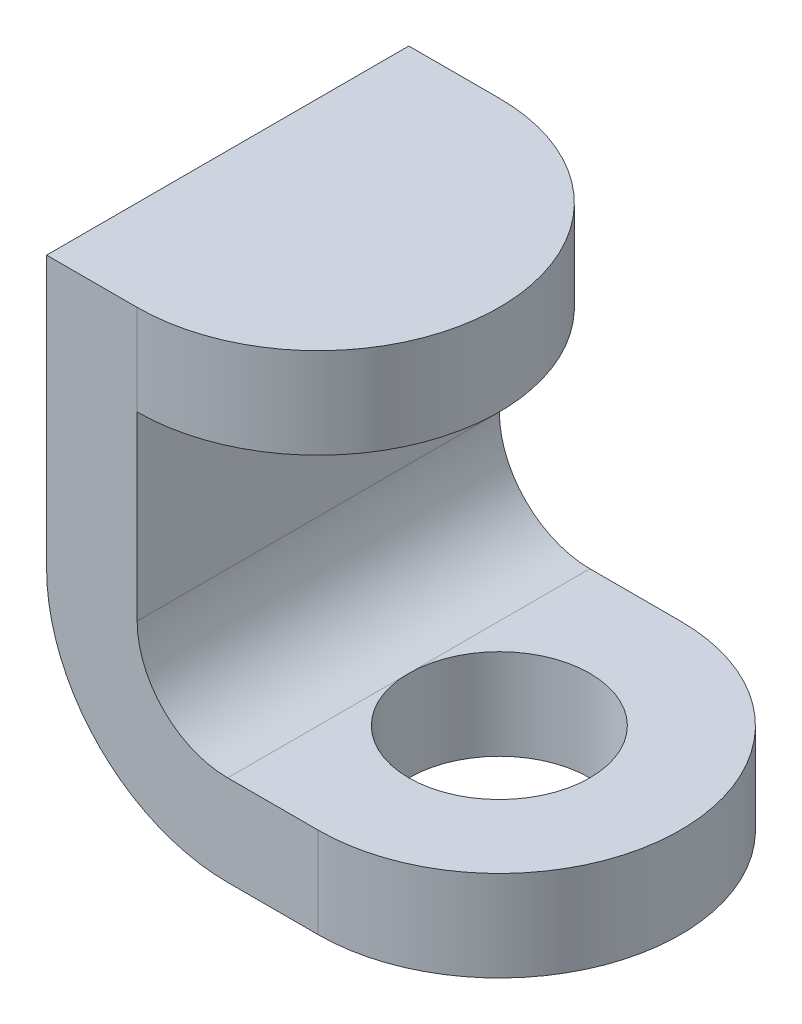
ISO-10303-21;
HEADER;
FILE_DESCRIPTION(('STEP AP214'),'2;1');
FILE_NAME('part.step','',(''),(''),'','','');
FILE_SCHEMA(('AUTOMOTIVE_DESIGN { 1 0 10303 214 1 1 1 1 }'));
ENDSEC;
DATA;
#1=APPLICATION_CONTEXT('core data for automotive mechanical design processes');
#2=APPLICATION_PROTOCOL_DEFINITION('international standard','automotive_design',2000,#1);
#3=PRODUCT_CONTEXT('',#1,'mechanical');
#4=PRODUCT('Part','Part','',(#3));
#5=PRODUCT_RELATED_PRODUCT_CATEGORY('part','',(#4));
#6=PRODUCT_DEFINITION_FORMATION('','',#4);
#7=PRODUCT_DEFINITION_CONTEXT('part definition',#1,'design');
#8=PRODUCT_DEFINITION('design','',#6,#7);
#9=PRODUCT_DEFINITION_SHAPE('','',#8);
#10=(LENGTH_UNIT() NAMED_UNIT(*) SI_UNIT(.MILLI.,.METRE.));
#11=(NAMED_UNIT(*) PLANE_ANGLE_UNIT() SI_UNIT($,.RADIAN.));
#12=(NAMED_UNIT(*) SI_UNIT($,.STERADIAN.) SOLID_ANGLE_UNIT());
#13=UNCERTAINTY_MEASURE_WITH_UNIT(LENGTH_MEASURE(1.E-05),#10,'distance_accuracy_value','');
#14=(GEOMETRIC_REPRESENTATION_CONTEXT(3) GLOBAL_UNCERTAINTY_ASSIGNED_CONTEXT((#13)) GLOBAL_UNIT_ASSIGNED_CONTEXT((#10,
#11,#12)) REPRESENTATION_CONTEXT('',''));
#15=CARTESIAN_POINT('',(0.,0.,0.));
#16=DIRECTION('',(0.,0.,1.));
#17=DIRECTION('',(1.,0.,0.));
#18=AXIS2_PLACEMENT_3D('',#15,#16,#17);
#19=CARTESIAN_POINT('',(30.,0.,0.));
#20=DIRECTION('',(0.,-1.,0.));
#21=DIRECTION('',(0.,0.,-1.));
#22=AXIS2_PLACEMENT_3D('',#19,#20,#21);
#23=CYLINDRICAL_SURFACE('',#22,20.);
#24=DIRECTION('',(0.,1.,0.));
#25=VECTOR('',#24,1.);
#26=CARTESIAN_POINT('',(30.,0.,20.));
#27=LINE('',#26,#25);
#28=CARTESIAN_POINT('',(30.,0.,20.));
#29=VERTEX_POINT('',#28);
#30=CARTESIAN_POINT('',(30.,10.,20.));
#31=VERTEX_POINT('',#30);
#32=EDGE_CURVE('E189',#29,#31,#27,.T.);
#33=ORIENTED_EDGE('',*,*,#32,.F.);
#34=CARTESIAN_POINT('',(30.,0.,0.));
#35=DIRECTION('',(0.,1.,0.));
#36=DIRECTION('',(0.,0.,1.));
#37=AXIS2_PLACEMENT_3D('',#34,#35,#36);
#38=CIRCLE('',#37,20.);
#39=CARTESIAN_POINT('',(30.,0.,-20.));
#40=VERTEX_POINT('',#39);
#41=EDGE_CURVE('E43',#40,#29,#38,.F.);
#42=ORIENTED_EDGE('',*,*,#41,.F.);
#43=DIRECTION('',(0.,-1.,0.));
#44=VECTOR('',#43,1.);
#45=CARTESIAN_POINT('',(30.,0.,-20.));
#46=LINE('',#45,#44);
#47=CARTESIAN_POINT('',(30.,10.,-20.));
#48=VERTEX_POINT('',#47);
#49=EDGE_CURVE('E192',#48,#40,#46,.T.);
#50=ORIENTED_EDGE('',*,*,#49,.F.);
#51=CARTESIAN_POINT('',(30.,10.,0.));
#52=DIRECTION('',(0.,1.,0.));
#53=DIRECTION('',(0.,0.,1.));
#54=AXIS2_PLACEMENT_3D('',#51,#52,#53);
#55=CIRCLE('',#54,20.);
#56=EDGE_CURVE('E11',#31,#48,#55,.T.);
#57=ORIENTED_EDGE('',*,*,#56,.F.);
#58=EDGE_LOOP('',(#33,#42,#50,#57));
#59=FACE_BOUND('',#58,.T.);
#60=ADVANCED_FACE('F35',(#59),#23,.T.);
#61=CARTESIAN_POINT('',(10.,40.,0.));
#62=DIRECTION('',(0.,-1.,0.));
#63=DIRECTION('',(0.,0.,-1.));
#64=AXIS2_PLACEMENT_3D('',#61,#62,#63);
#65=CYLINDRICAL_SURFACE('',#64,20.);
#66=DIRECTION('',(0.,1.,0.));
#67=VECTOR('',#66,1.);
#68=CARTESIAN_POINT('',(10.,40.,20.));
#69=LINE('',#68,#67);
#70=CARTESIAN_POINT('',(10.,40.,20.));
#71=VERTEX_POINT('',#70);
#72=CARTESIAN_POINT('',(10.,50.,20.));
#73=VERTEX_POINT('',#72);
#74=EDGE_CURVE('E121',#71,#73,#69,.T.);
#75=ORIENTED_EDGE('',*,*,#74,.F.);
#76=CARTESIAN_POINT('',(10.,40.,0.));
#77=DIRECTION('',(0.,-1.,0.));
#78=DIRECTION('',(0.,0.,-1.));
#79=AXIS2_PLACEMENT_3D('',#76,#77,#78);
#80=CIRCLE('',#79,20.);
#81=CARTESIAN_POINT('',(10.,40.,-20.));
#82=VERTEX_POINT('',#81);
#83=EDGE_CURVE('E108',#82,#71,#80,.T.);
#84=ORIENTED_EDGE('',*,*,#83,.F.);
#85=DIRECTION('',(0.,-1.,0.));
#86=VECTOR('',#85,1.);
#87=CARTESIAN_POINT('',(10.,0.,-20.));
#88=LINE('',#87,#86);
#89=CARTESIAN_POINT('',(10.,50.,-20.));
#90=VERTEX_POINT('',#89);
#91=EDGE_CURVE('E118',#90,#82,#88,.T.);
#92=ORIENTED_EDGE('',*,*,#91,.F.);
#93=CARTESIAN_POINT('',(10.,50.,0.));
#94=DIRECTION('',(0.,-1.,0.));
#95=DIRECTION('',(0.,0.,-1.));
#96=AXIS2_PLACEMENT_3D('',#93,#94,#95);
#97=CIRCLE('',#96,20.);
#98=EDGE_CURVE('E117',#73,#90,#97,.F.);
#99=ORIENTED_EDGE('',*,*,#98,.F.);
#100=EDGE_LOOP('',(#75,#84,#92,#99));
#101=FACE_BOUND('',#100,.T.);
#102=ADVANCED_FACE('F122',(#101),#65,.T.);
#103=CARTESIAN_POINT('',(0.,0.,20.));
#104=DIRECTION('',(0.,1.,0.));
#105=DIRECTION('',(0.,0.,1.));
#106=AXIS2_PLACEMENT_3D('',#103,#104,#105);
#107=PLANE('',#106);
#108=DIRECTION('',(0.,0.,-1.));
#109=VECTOR('',#108,1.);
#110=CARTESIAN_POINT('',(20.,0.,20.));
#111=LINE('',#110,#109);
#112=CARTESIAN_POINT('',(20.,0.,20.));
#113=VERTEX_POINT('',#112);
#114=CARTESIAN_POINT('',(20.,0.,0.));
#115=VERTEX_POINT('',#114);
#116=EDGE_CURVE('E169',#113,#115,#111,.T.);
#117=ORIENTED_EDGE('',*,*,#116,.T.);
#118=CARTESIAN_POINT('',(30.,0.,0.));
#119=DIRECTION('',(0.,1.,0.));
#120=DIRECTION('',(0.,0.,1.));
#121=AXIS2_PLACEMENT_3D('',#118,#119,#120);
#122=CIRCLE('',#121,10.);
#123=EDGE_CURVE('E48',#115,#115,#122,.T.);
#124=ORIENTED_EDGE('',*,*,#123,.T.);
#125=CARTESIAN_POINT('',(20.,0.,-20.));
#126=VERTEX_POINT('',#125);
#127=EDGE_CURVE('E136',#115,#126,#111,.T.);
#128=ORIENTED_EDGE('',*,*,#127,.T.);
#129=DIRECTION('',(1.,0.,0.));
#130=VECTOR('',#129,1.);
#131=CARTESIAN_POINT('',(0.,0.,-20.));
#132=LINE('',#131,#130);
#133=EDGE_CURVE('E155',#126,#40,#132,.T.);
#134=ORIENTED_EDGE('',*,*,#133,.T.);
#135=ORIENTED_EDGE('',*,*,#41,.T.);
#136=DIRECTION('',(1.,0.,0.));
#137=VECTOR('',#136,1.);
#138=CARTESIAN_POINT('',(0.,0.,20.));
#139=LINE('',#138,#137);
#140=EDGE_CURVE('E149',#113,#29,#139,.T.);
#141=ORIENTED_EDGE('',*,*,#140,.F.);
#142=EDGE_LOOP('',(#117,#124,#128,#134,#135,#141));
#143=FACE_BOUND('',#142,.T.);
#144=ADVANCED_FACE('F197',(#143),#107,.F.);
#145=CARTESIAN_POINT('',(0.,10.,20.));
#146=DIRECTION('',(0.,1.,0.));
#147=DIRECTION('',(0.,0.,1.));
#148=AXIS2_PLACEMENT_3D('',#145,#146,#147);
#149=PLANE('',#148);
#150=DIRECTION('',(0.,0.,-1.));
#151=VECTOR('',#150,1.);
#152=CARTESIAN_POINT('',(20.,10.,20.));
#153=LINE('',#152,#151);
#154=CARTESIAN_POINT('',(20.,10.,-20.));
#155=VERTEX_POINT('',#154);
#156=CARTESIAN_POINT('',(20.,10.,0.));
#157=VERTEX_POINT('',#156);
#158=EDGE_CURVE('E181',#155,#157,#153,.F.);
#159=ORIENTED_EDGE('',*,*,#158,.T.);
#160=CARTESIAN_POINT('',(30.,10.,0.));
#161=DIRECTION('',(0.,1.,0.));
#162=DIRECTION('',(0.,0.,1.));
#163=AXIS2_PLACEMENT_3D('',#160,#161,#162);
#164=CIRCLE('',#163,10.);
#165=EDGE_CURVE('E53',#157,#157,#164,.T.);
#166=ORIENTED_EDGE('',*,*,#165,.F.);
#167=CARTESIAN_POINT('',(20.,10.,20.));
#168=VERTEX_POINT('',#167);
#169=EDGE_CURVE('E180',#157,#168,#153,.F.);
#170=ORIENTED_EDGE('',*,*,#169,.T.);
#171=DIRECTION('',(1.,0.,0.));
#172=VECTOR('',#171,1.);
#173=CARTESIAN_POINT('',(0.,10.,20.));
#174=LINE('',#173,#172);
#175=EDGE_CURVE('E144',#168,#31,#174,.T.);
#176=ORIENTED_EDGE('',*,*,#175,.T.);
#177=ORIENTED_EDGE('',*,*,#56,.T.);
#178=DIRECTION('',(1.,0.,0.));
#179=VECTOR('',#178,1.);
#180=CARTESIAN_POINT('',(0.,10.,-20.));
#181=LINE('',#180,#179);
#182=EDGE_CURVE('E158',#155,#48,#181,.T.);
#183=ORIENTED_EDGE('',*,*,#182,.F.);
#184=EDGE_LOOP('',(#159,#166,#170,#176,#177,#183));
#185=FACE_BOUND('',#184,.T.);
#186=ADVANCED_FACE('F216',(#185),#149,.T.);
#187=CARTESIAN_POINT('',(10.,0.,20.));
#188=DIRECTION('',(1.,0.,0.));
#189=DIRECTION('',(0.,0.,-1.));
#190=AXIS2_PLACEMENT_3D('',#187,#188,#189);
#191=PLANE('',#190);
#192=DIRECTION('',(0.,1.,0.));
#193=VECTOR('',#192,1.);
#194=CARTESIAN_POINT('',(10.,0.,20.));
#195=LINE('',#194,#193);
#196=CARTESIAN_POINT('',(10.,20.,20.));
#197=VERTEX_POINT('',#196);
#198=EDGE_CURVE('E132',#71,#197,#195,.F.);
#199=ORIENTED_EDGE('',*,*,#198,.T.);
#200=DIRECTION('',(0.,0.,-1.));
#201=VECTOR('',#200,1.);
#202=CARTESIAN_POINT('',(10.,20.,-20.));
#203=LINE('',#202,#201);
#204=CARTESIAN_POINT('',(10.,20.,-20.));
#205=VERTEX_POINT('',#204);
#206=EDGE_CURVE('E178',#197,#205,#203,.T.);
#207=ORIENTED_EDGE('',*,*,#206,.T.);
#208=DIRECTION('',(0.,1.,0.));
#209=VECTOR('',#208,1.);
#210=CARTESIAN_POINT('',(10.,0.,-20.));
#211=LINE('',#210,#209);
#212=EDGE_CURVE('E135',#82,#205,#211,.F.);
#213=ORIENTED_EDGE('',*,*,#212,.F.);
#214=DIRECTION('',(0.,0.,-1.));
#215=VECTOR('',#214,1.);
#216=CARTESIAN_POINT('',(10.,40.,20.));
#217=LINE('',#216,#215);
#218=EDGE_CURVE('E112',#71,#82,#217,.T.);
#219=ORIENTED_EDGE('',*,*,#218,.F.);
#220=EDGE_LOOP('',(#199,#207,#213,#219));
#221=FACE_BOUND('',#220,.T.);
#222=ADVANCED_FACE('F130',(#221),#191,.T.);
#223=CARTESIAN_POINT('',(0.,40.,20.));
#224=DIRECTION('',(0.,-1.,0.));
#225=DIRECTION('',(0.,0.,-1.));
#226=AXIS2_PLACEMENT_3D('',#223,#224,#225);
#227=PLANE('',#226);
#228=ORIENTED_EDGE('',*,*,#218,.T.);
#229=ORIENTED_EDGE('',*,*,#83,.T.);
#230=EDGE_LOOP('',(#228,#229));
#231=FACE_BOUND('',#230,.T.);
#232=ADVANCED_FACE('F110',(#231),#227,.T.);
#233=CARTESIAN_POINT('',(0.,50.,20.));
#234=DIRECTION('',(0.,-1.,0.));
#235=DIRECTION('',(0.,0.,-1.));
#236=AXIS2_PLACEMENT_3D('',#233,#234,#235);
#237=PLANE('',#236);
#238=DIRECTION('',(-1.,0.,0.));
#239=VECTOR('',#238,1.);
#240=CARTESIAN_POINT('',(0.,50.,20.));
#241=LINE('',#240,#239);
#242=CARTESIAN_POINT('',(0.,50.,20.));
#243=VERTEX_POINT('',#242);
#244=EDGE_CURVE('E143',#73,#243,#241,.T.);
#245=ORIENTED_EDGE('',*,*,#244,.F.);
#246=ORIENTED_EDGE('',*,*,#98,.T.);
#247=DIRECTION('',(-1.,0.,0.));
#248=VECTOR('',#247,1.);
#249=CARTESIAN_POINT('',(0.,50.,-20.));
#250=LINE('',#249,#248);
#251=CARTESIAN_POINT('',(0.,50.,-20.));
#252=VERTEX_POINT('',#251);
#253=EDGE_CURVE('E162',#90,#252,#250,.T.);
#254=ORIENTED_EDGE('',*,*,#253,.T.);
#255=DIRECTION('',(0.,0.,-1.));
#256=VECTOR('',#255,1.);
#257=CARTESIAN_POINT('',(0.,50.,20.));
#258=LINE('',#257,#256);
#259=EDGE_CURVE('E137',#243,#252,#258,.T.);
#260=ORIENTED_EDGE('',*,*,#259,.F.);
#261=EDGE_LOOP('',(#245,#246,#254,#260));
#262=FACE_BOUND('',#261,.T.);
#263=ADVANCED_FACE('F223',(#262),#237,.F.);
#264=CARTESIAN_POINT('',(0.,0.,20.));
#265=DIRECTION('',(1.,0.,0.));
#266=DIRECTION('',(0.,0.,-1.));
#267=AXIS2_PLACEMENT_3D('',#264,#265,#266);
#268=PLANE('',#267);
#269=DIRECTION('',(0.,-1.,0.));
#270=VECTOR('',#269,1.);
#271=CARTESIAN_POINT('',(0.,0.,-20.));
#272=LINE('',#271,#270);
#273=CARTESIAN_POINT('',(0.,20.,-20.));
#274=VERTEX_POINT('',#273);
#275=EDGE_CURVE('E164',#252,#274,#272,.T.);
#276=ORIENTED_EDGE('',*,*,#275,.T.);
#277=DIRECTION('',(0.,0.,-1.));
#278=VECTOR('',#277,1.);
#279=CARTESIAN_POINT('',(0.,20.,20.));
#280=LINE('',#279,#278);
#281=CARTESIAN_POINT('',(0.,20.,20.));
#282=VERTEX_POINT('',#281);
#283=EDGE_CURVE('E174',#274,#282,#280,.F.);
#284=ORIENTED_EDGE('',*,*,#283,.T.);
#285=DIRECTION('',(0.,-1.,0.));
#286=VECTOR('',#285,1.);
#287=CARTESIAN_POINT('',(0.,0.,20.));
#288=LINE('',#287,#286);
#289=EDGE_CURVE('E146',#243,#282,#288,.T.);
#290=ORIENTED_EDGE('',*,*,#289,.F.);
#291=ORIENTED_EDGE('',*,*,#259,.T.);
#292=EDGE_LOOP('',(#276,#284,#290,#291));
#293=FACE_BOUND('',#292,.T.);
#294=ADVANCED_FACE('F226',(#293),#268,.F.);
#295=CARTESIAN_POINT('',(0.,0.,20.));
#296=DIRECTION('',(0.,0.,-1.));
#297=DIRECTION('',(-1.,0.,0.));
#298=AXIS2_PLACEMENT_3D('',#295,#296,#297);
#299=PLANE('',#298);
#300=ORIENTED_EDGE('',*,*,#140,.T.);
#301=ORIENTED_EDGE('',*,*,#32,.T.);
#302=ORIENTED_EDGE('',*,*,#175,.F.);
#303=CARTESIAN_POINT('',(20.,20.,20.));
#304=DIRECTION('',(0.,0.,-1.));
#305=DIRECTION('',(-1.,0.,0.));
#306=AXIS2_PLACEMENT_3D('',#303,#304,#305);
#307=CIRCLE('',#306,10.);
#308=EDGE_CURVE('E126',#168,#197,#307,.T.);
#309=ORIENTED_EDGE('',*,*,#308,.T.);
#310=ORIENTED_EDGE('',*,*,#198,.F.);
#311=ORIENTED_EDGE('',*,*,#74,.T.);
#312=ORIENTED_EDGE('',*,*,#244,.T.);
#313=ORIENTED_EDGE('',*,*,#289,.T.);
#314=CARTESIAN_POINT('',(20.,20.,20.));
#315=DIRECTION('',(0.,0.,-1.));
#316=DIRECTION('',(-1.,0.,0.));
#317=AXIS2_PLACEMENT_3D('',#314,#315,#316);
#318=CIRCLE('',#317,20.);
#319=EDGE_CURVE('E176',#282,#113,#318,.F.);
#320=ORIENTED_EDGE('',*,*,#319,.T.);
#321=EDGE_LOOP('',(#300,#301,#302,#309,#310,#311,#312,#313,#320));
#322=FACE_BOUND('',#321,.T.);
#323=ADVANCED_FACE('F140',(#322),#299,.F.);
#324=CARTESIAN_POINT('',(0.,0.,-20.));
#325=DIRECTION('',(0.,0.,-1.));
#326=DIRECTION('',(-1.,0.,0.));
#327=AXIS2_PLACEMENT_3D('',#324,#325,#326);
#328=PLANE('',#327);
#329=ORIENTED_EDGE('',*,*,#182,.T.);
#330=ORIENTED_EDGE('',*,*,#49,.T.);
#331=ORIENTED_EDGE('',*,*,#133,.F.);
#332=CARTESIAN_POINT('',(20.,20.,-20.));
#333=DIRECTION('',(0.,0.,-1.));
#334=DIRECTION('',(-1.,0.,0.));
#335=AXIS2_PLACEMENT_3D('',#332,#333,#334);
#336=CIRCLE('',#335,20.);
#337=EDGE_CURVE('E172',#126,#274,#336,.T.);
#338=ORIENTED_EDGE('',*,*,#337,.T.);
#339=ORIENTED_EDGE('',*,*,#275,.F.);
#340=ORIENTED_EDGE('',*,*,#253,.F.);
#341=ORIENTED_EDGE('',*,*,#91,.T.);
#342=ORIENTED_EDGE('',*,*,#212,.T.);
#343=CARTESIAN_POINT('',(20.,20.,-20.));
#344=DIRECTION('',(0.,0.,-1.));
#345=DIRECTION('',(-1.,0.,0.));
#346=AXIS2_PLACEMENT_3D('',#343,#344,#345);
#347=CIRCLE('',#346,10.);
#348=EDGE_CURVE('E184',#205,#155,#347,.F.);
#349=ORIENTED_EDGE('',*,*,#348,.T.);
#350=EDGE_LOOP('',(#329,#330,#331,#338,#339,#340,#341,#342,#349));
#351=FACE_BOUND('',#350,.T.);
#352=ADVANCED_FACE('F212',(#351),#328,.T.);
#353=CARTESIAN_POINT('',(20.,20.,20.));
#354=DIRECTION('',(0.,0.,-1.));
#355=DIRECTION('',(-1.,0.,0.));
#356=AXIS2_PLACEMENT_3D('',#353,#354,#355);
#357=CYLINDRICAL_SURFACE('',#356,20.);
#358=ORIENTED_EDGE('',*,*,#319,.F.);
#359=ORIENTED_EDGE('',*,*,#283,.F.);
#360=ORIENTED_EDGE('',*,*,#337,.F.);
#361=ORIENTED_EDGE('',*,*,#127,.F.);
#362=ORIENTED_EDGE('',*,*,#116,.F.);
#363=EDGE_LOOP('',(#358,#359,#360,#361,#362));
#364=FACE_BOUND('',#363,.T.);
#365=ADVANCED_FACE('F208',(#364),#357,.T.);
#366=CARTESIAN_POINT('',(20.,20.,20.));
#367=DIRECTION('',(0.,0.,1.));
#368=DIRECTION('',(1.,0.,0.));
#369=AXIS2_PLACEMENT_3D('',#366,#367,#368);
#370=CYLINDRICAL_SURFACE('',#369,10.);
#371=ORIENTED_EDGE('',*,*,#308,.F.);
#372=ORIENTED_EDGE('',*,*,#169,.F.);
#373=ORIENTED_EDGE('',*,*,#158,.F.);
#374=ORIENTED_EDGE('',*,*,#348,.F.);
#375=ORIENTED_EDGE('',*,*,#206,.F.);
#376=EDGE_LOOP('',(#371,#372,#373,#374,#375));
#377=FACE_BOUND('',#376,.T.);
#378=ADVANCED_FACE('F219',(#377),#370,.F.);
#379=CARTESIAN_POINT('',(30.,0.,0.));
#380=DIRECTION('',(0.,1.,0.));
#381=DIRECTION('',(0.,0.,1.));
#382=AXIS2_PLACEMENT_3D('',#379,#380,#381);
#383=CYLINDRICAL_SURFACE('',#382,10.);
#384=ORIENTED_EDGE('',*,*,#123,.F.);
#385=EDGE_LOOP('',(#384));
#386=FACE_BOUND('',#385,.T.);
#387=ORIENTED_EDGE('',*,*,#165,.T.);
#388=EDGE_LOOP('',(#387));
#389=FACE_BOUND('',#388,.T.);
#390=ADVANCED_FACE('F250',(#386,#389),#383,.F.);
#391=CLOSED_SHELL('',(#60,#102,#144,#186,#222,#232,#263,#294,#323,#352,#365,#378,#390));
#392=MANIFOLD_SOLID_BREP('B2',#391);
#393=ADVANCED_BREP_SHAPE_REPRESENTATION('',(#18,#392),#14);
#394=SHAPE_DEFINITION_REPRESENTATION(#9,#393);
ENDSEC;
END-ISO-10303-21;
